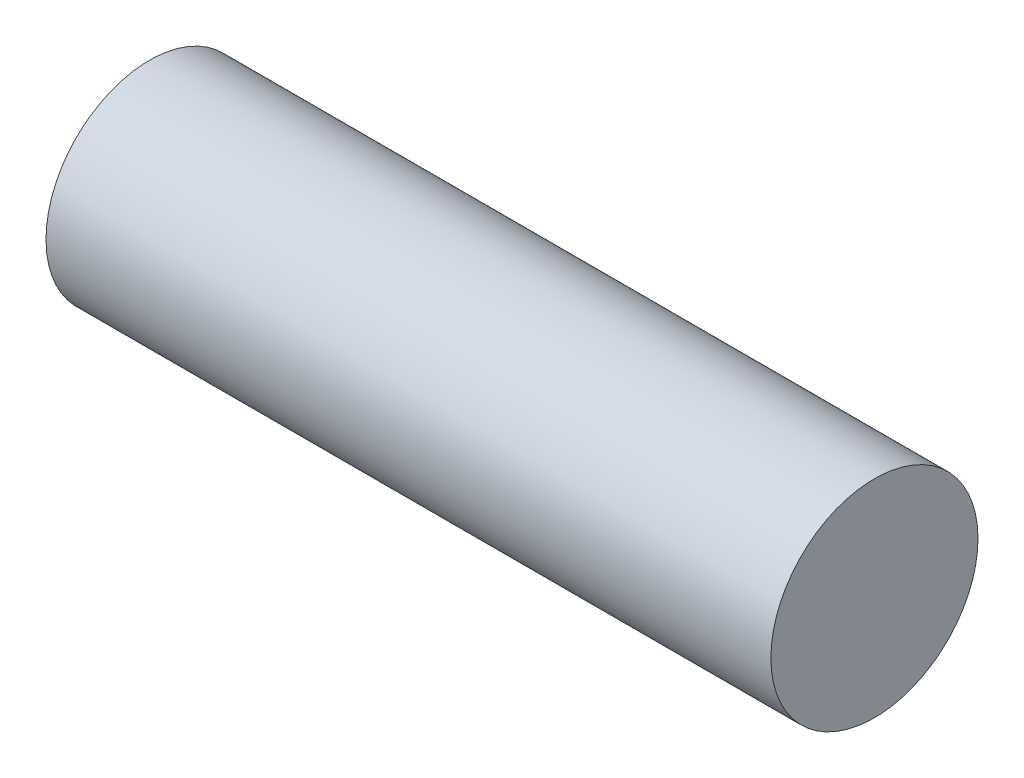
ISO-10303-21;
HEADER;
FILE_DESCRIPTION(('STEP AP214'),'2;1');
FILE_NAME('part.step','',(''),(''),'','','');
FILE_SCHEMA(('AUTOMOTIVE_DESIGN { 1 0 10303 214 1 1 1 1 }'));
ENDSEC;
DATA;
#1=APPLICATION_CONTEXT('core data for automotive mechanical design processes');
#2=APPLICATION_PROTOCOL_DEFINITION('international standard','automotive_design',2000,#1);
#3=PRODUCT_CONTEXT('',#1,'mechanical');
#4=PRODUCT('Part','Part','',(#3));
#5=PRODUCT_RELATED_PRODUCT_CATEGORY('part','',(#4));
#6=PRODUCT_DEFINITION_FORMATION('','',#4);
#7=PRODUCT_DEFINITION_CONTEXT('part definition',#1,'design');
#8=PRODUCT_DEFINITION('design','',#6,#7);
#9=PRODUCT_DEFINITION_SHAPE('','',#8);
#10=(LENGTH_UNIT() NAMED_UNIT(*) SI_UNIT(.MILLI.,.METRE.));
#11=(NAMED_UNIT(*) PLANE_ANGLE_UNIT() SI_UNIT($,.RADIAN.));
#12=(NAMED_UNIT(*) SI_UNIT($,.STERADIAN.) SOLID_ANGLE_UNIT());
#13=UNCERTAINTY_MEASURE_WITH_UNIT(LENGTH_MEASURE(1.E-05),#10,'distance_accuracy_value','');
#14=(GEOMETRIC_REPRESENTATION_CONTEXT(3) GLOBAL_UNCERTAINTY_ASSIGNED_CONTEXT((#13)) GLOBAL_UNIT_ASSIGNED_CONTEXT((#10,
#11,#12)) REPRESENTATION_CONTEXT('',''));
#15=CARTESIAN_POINT('',(0.,0.,0.));
#16=DIRECTION('',(0.,0.,1.));
#17=DIRECTION('',(1.,0.,0.));
#18=AXIS2_PLACEMENT_3D('',#15,#16,#17);
#19=CARTESIAN_POINT('',(14.,0.,0.));
#20=DIRECTION('',(1.,0.,0.));
#21=DIRECTION('',(0.,0.,-1.));
#22=AXIS2_PLACEMENT_3D('',#19,#20,#21);
#23=CYLINDRICAL_SURFACE('',#22,4.);
#24=CARTESIAN_POINT('',(14.,0.,0.));
#25=DIRECTION('',(1.,0.,0.));
#26=DIRECTION('',(0.,0.,-1.));
#27=AXIS2_PLACEMENT_3D('',#24,#25,#26);
#28=CIRCLE('',#27,4.);
#29=CARTESIAN_POINT('',(14.,0.,-4.));
#30=VERTEX_POINT('',#29);
#31=EDGE_CURVE('E44',#30,#30,#28,.T.);
#32=ORIENTED_EDGE('',*,*,#31,.F.);
#33=EDGE_LOOP('',(#32));
#34=FACE_BOUND('',#33,.T.);
#35=CARTESIAN_POINT('',(-14.,0.,0.));
#36=DIRECTION('',(1.,0.,0.));
#37=DIRECTION('',(0.,0.,-1.));
#38=AXIS2_PLACEMENT_3D('',#35,#36,#37);
#39=CIRCLE('',#38,4.);
#40=CARTESIAN_POINT('',(-14.,0.,-4.));
#41=VERTEX_POINT('',#40);
#42=EDGE_CURVE('E10',#41,#41,#39,.T.);
#43=ORIENTED_EDGE('',*,*,#42,.T.);
#44=EDGE_LOOP('',(#43));
#45=FACE_BOUND('',#44,.T.);
#46=ADVANCED_FACE('F37',(#34,#45),#23,.T.);
#47=CARTESIAN_POINT('',(-14.,0.,0.));
#48=DIRECTION('',(-1.,0.,0.));
#49=DIRECTION('',(0.,0.,1.));
#50=AXIS2_PLACEMENT_3D('',#47,#48,#49);
#51=PLANE('',#50);
#52=ORIENTED_EDGE('',*,*,#42,.F.);
#53=EDGE_LOOP('',(#52));
#54=FACE_BOUND('',#53,.T.);
#55=ADVANCED_FACE('F54',(#54),#51,.T.);
#56=CARTESIAN_POINT('',(14.,0.,0.));
#57=DIRECTION('',(-1.,0.,0.));
#58=DIRECTION('',(0.,0.,1.));
#59=AXIS2_PLACEMENT_3D('',#56,#57,#58);
#60=PLANE('',#59);
#61=ORIENTED_EDGE('',*,*,#31,.T.);
#62=EDGE_LOOP('',(#61));
#63=FACE_BOUND('',#62,.T.);
#64=ADVANCED_FACE('F51',(#63),#60,.F.);
#65=CLOSED_SHELL('',(#46,#55,#64));
#66=MANIFOLD_SOLID_BREP('B2',#65);
#67=ADVANCED_BREP_SHAPE_REPRESENTATION('',(#18,#66),#14);
#68=SHAPE_DEFINITION_REPRESENTATION(#9,#67);
ENDSEC;
END-ISO-10303-21;
